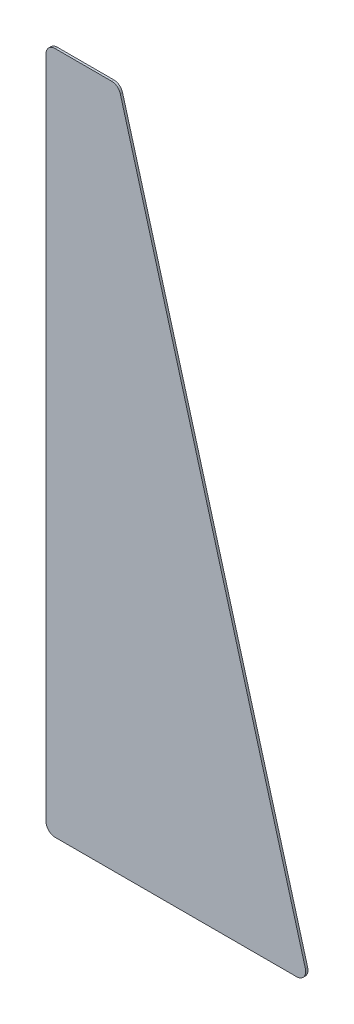
ISO-10303-21;
HEADER;
FILE_DESCRIPTION(('STEP AP214'),'2;1');
FILE_NAME('part.step','',(''),(''),'','','');
FILE_SCHEMA(('AUTOMOTIVE_DESIGN { 1 0 10303 214 1 1 1 1 }'));
ENDSEC;
DATA;
#1=APPLICATION_CONTEXT('core data for automotive mechanical design processes');
#2=APPLICATION_PROTOCOL_DEFINITION('international standard','automotive_design',2000,#1);
#3=PRODUCT_CONTEXT('',#1,'mechanical');
#4=PRODUCT('Part','Part','',(#3));
#5=PRODUCT_RELATED_PRODUCT_CATEGORY('part','',(#4));
#6=PRODUCT_DEFINITION_FORMATION('','',#4);
#7=PRODUCT_DEFINITION_CONTEXT('part definition',#1,'design');
#8=PRODUCT_DEFINITION('design','',#6,#7);
#9=PRODUCT_DEFINITION_SHAPE('','',#8);
#10=(LENGTH_UNIT() NAMED_UNIT(*) SI_UNIT(.MILLI.,.METRE.));
#11=(NAMED_UNIT(*) PLANE_ANGLE_UNIT() SI_UNIT($,.RADIAN.));
#12=(NAMED_UNIT(*) SI_UNIT($,.STERADIAN.) SOLID_ANGLE_UNIT());
#13=UNCERTAINTY_MEASURE_WITH_UNIT(LENGTH_MEASURE(1.E-05),#10,'distance_accuracy_value','');
#14=(GEOMETRIC_REPRESENTATION_CONTEXT(3) GLOBAL_UNCERTAINTY_ASSIGNED_CONTEXT((#13)) GLOBAL_UNIT_ASSIGNED_CONTEXT((#10,
#11,#12)) REPRESENTATION_CONTEXT('',''));
#15=CARTESIAN_POINT('',(0.,0.,0.));
#16=DIRECTION('',(0.,0.,1.));
#17=DIRECTION('',(1.,0.,0.));
#18=AXIS2_PLACEMENT_3D('',#15,#16,#17);
#19=CARTESIAN_POINT('',(184.15,0.,1.5875));
#20=DIRECTION('',(0.,1.,0.));
#21=DIRECTION('',(-1.,0.,0.));
#22=AXIS2_PLACEMENT_3D('',#19,#20,#21);
#23=PLANE('',#22);
#24=DIRECTION('',(1.,0.,0.));
#25=VECTOR('',#24,1.);
#26=CARTESIAN_POINT('',(184.15,0.,0.));
#27=LINE('',#26,#25);
#28=CARTESIAN_POINT('',(6.34999999999999,0.,0.));
#29=VERTEX_POINT('',#28);
#30=CARTESIAN_POINT('',(175.791529201927,0.,0.));
#31=VERTEX_POINT('',#30);
#32=EDGE_CURVE('E130',#29,#31,#27,.T.);
#33=ORIENTED_EDGE('',*,*,#32,.T.);
#34=DIRECTION('',(0.,0.,-1.));
#35=VECTOR('',#34,1.);
#36=CARTESIAN_POINT('',(175.791529201927,0.,1.5875));
#37=LINE('',#36,#35);
#38=CARTESIAN_POINT('',(175.791529201927,0.,1.5875));
#39=VERTEX_POINT('',#38);
#40=EDGE_CURVE('E108',#31,#39,#37,.F.);
#41=ORIENTED_EDGE('',*,*,#40,.T.);
#42=DIRECTION('',(1.,0.,0.));
#43=VECTOR('',#42,1.);
#44=CARTESIAN_POINT('',(184.15,0.,1.5875));
#45=LINE('',#44,#43);
#46=CARTESIAN_POINT('',(6.34999999999999,0.,1.5875));
#47=VERTEX_POINT('',#46);
#48=EDGE_CURVE('E139',#47,#39,#45,.T.);
#49=ORIENTED_EDGE('',*,*,#48,.F.);
#50=DIRECTION('',(0.,0.,-1.));
#51=VECTOR('',#50,1.);
#52=CARTESIAN_POINT('',(6.34999999999999,0.,1.5875));
#53=LINE('',#52,#51);
#54=EDGE_CURVE('E113',#47,#29,#53,.T.);
#55=ORIENTED_EDGE('',*,*,#54,.T.);
#56=EDGE_LOOP('',(#33,#41,#49,#55));
#57=FACE_BOUND('',#56,.T.);
#58=ADVANCED_FACE('F37',(#57),#23,.F.);
#59=CARTESIAN_POINT('',(50.8,479.171,1.5875));
#60=DIRECTION('',(-0.963389764635829,-0.268104758247448,0.));
#61=DIRECTION('',(0.268104758247448,-0.963389764635829,0.));
#62=AXIS2_PLACEMENT_3D('',#59,#60,#61);
#63=PLANE('',#62);
#64=DIRECTION('',(-0.268104758247448,0.963389764635829,0.));
#65=VECTOR('',#64,1.);
#66=CARTESIAN_POINT('',(50.8,479.171,1.5875));
#67=LINE('',#66,#65);
#68=CARTESIAN_POINT('',(181.909054207364,8.05246521487124,1.5875));
#69=VERTEX_POINT('',#68);
#70=CARTESIAN_POINT('',(52.0933770274013,474.523465214871,1.5875));
#71=VERTEX_POINT('',#70);
#72=EDGE_CURVE('E123',#69,#71,#67,.T.);
#73=ORIENTED_EDGE('',*,*,#72,.F.);
#74=DIRECTION('',(0.,0.,-1.));
#75=VECTOR('',#74,1.);
#76=CARTESIAN_POINT('',(181.909054207364,8.05246521487124,1.5875));
#77=LINE('',#76,#75);
#78=CARTESIAN_POINT('',(181.909054207364,8.05246521487124,0.));
#79=VERTEX_POINT('',#78);
#80=EDGE_CURVE('E107',#69,#79,#77,.T.);
#81=ORIENTED_EDGE('',*,*,#80,.T.);
#82=DIRECTION('',(-0.268104758247448,0.963389764635829,0.));
#83=VECTOR('',#82,1.);
#84=CARTESIAN_POINT('',(50.8,479.171,0.));
#85=LINE('',#84,#83);
#86=CARTESIAN_POINT('',(52.0933770274013,474.523465214871,0.));
#87=VERTEX_POINT('',#86);
#88=EDGE_CURVE('E120',#79,#87,#85,.T.);
#89=ORIENTED_EDGE('',*,*,#88,.T.);
#90=DIRECTION('',(0.,0.,-1.));
#91=VECTOR('',#90,1.);
#92=CARTESIAN_POINT('',(52.0933770274013,474.523465214871,1.5875));
#93=LINE('',#92,#91);
#94=EDGE_CURVE('E125',#87,#71,#93,.F.);
#95=ORIENTED_EDGE('',*,*,#94,.T.);
#96=EDGE_LOOP('',(#73,#81,#89,#95));
#97=FACE_BOUND('',#96,.T.);
#98=ADVANCED_FACE('F119',(#97),#63,.F.);
#99=CARTESIAN_POINT('',(0.,479.171,1.5875));
#100=DIRECTION('',(0.,-1.,0.));
#101=DIRECTION('',(0.,0.,-1.));
#102=AXIS2_PLACEMENT_3D('',#99,#100,#101);
#103=PLANE('',#102);
#104=DIRECTION('',(-1.,0.,0.));
#105=VECTOR('',#104,1.);
#106=CARTESIAN_POINT('',(0.,479.171,1.5875));
#107=LINE('',#106,#105);
#108=CARTESIAN_POINT('',(45.9758520219638,479.171,1.5875));
#109=VERTEX_POINT('',#108);
#110=CARTESIAN_POINT('',(6.35,479.171,1.5875));
#111=VERTEX_POINT('',#110);
#112=EDGE_CURVE('E165',#109,#111,#107,.T.);
#113=ORIENTED_EDGE('',*,*,#112,.F.);
#114=DIRECTION('',(0.,0.,-1.));
#115=VECTOR('',#114,1.);
#116=CARTESIAN_POINT('',(45.9758520219638,479.171,1.5875));
#117=LINE('',#116,#115);
#118=CARTESIAN_POINT('',(45.9758520219638,479.171,0.));
#119=VERTEX_POINT('',#118);
#120=EDGE_CURVE('E158',#109,#119,#117,.T.);
#121=ORIENTED_EDGE('',*,*,#120,.T.);
#122=DIRECTION('',(-1.,0.,0.));
#123=VECTOR('',#122,1.);
#124=CARTESIAN_POINT('',(0.,479.171,0.));
#125=LINE('',#124,#123);
#126=CARTESIAN_POINT('',(6.35,479.171,0.));
#127=VERTEX_POINT('',#126);
#128=EDGE_CURVE('E129',#119,#127,#125,.T.);
#129=ORIENTED_EDGE('',*,*,#128,.T.);
#130=DIRECTION('',(0.,0.,-1.));
#131=VECTOR('',#130,1.);
#132=CARTESIAN_POINT('',(6.35,479.171,1.5875));
#133=LINE('',#132,#131);
#134=EDGE_CURVE('E156',#127,#111,#133,.F.);
#135=ORIENTED_EDGE('',*,*,#134,.T.);
#136=EDGE_LOOP('',(#113,#121,#129,#135));
#137=FACE_BOUND('',#136,.T.);
#138=ADVANCED_FACE('F163',(#137),#103,.F.);
#139=CARTESIAN_POINT('',(0.,0.,1.5875));
#140=DIRECTION('',(1.,0.,0.));
#141=DIRECTION('',(0.,0.,-1.));
#142=AXIS2_PLACEMENT_3D('',#139,#140,#141);
#143=PLANE('',#142);
#144=DIRECTION('',(0.,-1.,0.));
#145=VECTOR('',#144,1.);
#146=CARTESIAN_POINT('',(0.,0.,1.5875));
#147=LINE('',#146,#145);
#148=CARTESIAN_POINT('',(0.,472.821,1.5875));
#149=VERTEX_POINT('',#148);
#150=CARTESIAN_POINT('',(0.,6.35,1.5875));
#151=VERTEX_POINT('',#150);
#152=EDGE_CURVE('E140',#149,#151,#147,.T.);
#153=ORIENTED_EDGE('',*,*,#152,.F.);
#154=DIRECTION('',(0.,0.,-1.));
#155=VECTOR('',#154,1.);
#156=CARTESIAN_POINT('',(0.,472.821,1.5875));
#157=LINE('',#156,#155);
#158=CARTESIAN_POINT('',(0.,472.821,0.));
#159=VERTEX_POINT('',#158);
#160=EDGE_CURVE('E11',#149,#159,#157,.T.);
#161=ORIENTED_EDGE('',*,*,#160,.T.);
#162=DIRECTION('',(0.,-1.,0.));
#163=VECTOR('',#162,1.);
#164=CARTESIAN_POINT('',(0.,0.,0.));
#165=LINE('',#164,#163);
#166=CARTESIAN_POINT('',(0.,6.35,0.));
#167=VERTEX_POINT('',#166);
#168=EDGE_CURVE('E133',#159,#167,#165,.T.);
#169=ORIENTED_EDGE('',*,*,#168,.T.);
#170=DIRECTION('',(0.,0.,-1.));
#171=VECTOR('',#170,1.);
#172=CARTESIAN_POINT('',(0.,6.35,1.5875));
#173=LINE('',#172,#171);
#174=EDGE_CURVE('E45',#167,#151,#173,.F.);
#175=ORIENTED_EDGE('',*,*,#174,.T.);
#176=EDGE_LOOP('',(#153,#161,#169,#175));
#177=FACE_BOUND('',#176,.T.);
#178=ADVANCED_FACE('F172',(#177),#143,.F.);
#179=CARTESIAN_POINT('',(0.,0.,1.5875));
#180=DIRECTION('',(0.,0.,-1.));
#181=DIRECTION('',(-1.,0.,0.));
#182=AXIS2_PLACEMENT_3D('',#179,#180,#181);
#183=PLANE('',#182);
#184=ORIENTED_EDGE('',*,*,#48,.T.);
#185=CARTESIAN_POINT('',(175.791529201927,6.35000000000002,1.5875));
#186=DIRECTION('',(0.,0.,-1.));
#187=DIRECTION('',(-1.,0.,0.));
#188=AXIS2_PLACEMENT_3D('',#185,#186,#187);
#189=CIRCLE('',#188,6.35);
#190=EDGE_CURVE('E154',#39,#69,#189,.F.);
#191=ORIENTED_EDGE('',*,*,#190,.T.);
#192=ORIENTED_EDGE('',*,*,#72,.T.);
#193=CARTESIAN_POINT('',(45.9758520219638,472.821,1.5875));
#194=DIRECTION('',(0.,0.,-1.));
#195=DIRECTION('',(-1.,0.,0.));
#196=AXIS2_PLACEMENT_3D('',#193,#194,#195);
#197=CIRCLE('',#196,6.35);
#198=EDGE_CURVE('E152',#71,#109,#197,.F.);
#199=ORIENTED_EDGE('',*,*,#198,.T.);
#200=ORIENTED_EDGE('',*,*,#112,.T.);
#201=CARTESIAN_POINT('',(6.35,472.821,1.5875));
#202=DIRECTION('',(0.,0.,-1.));
#203=DIRECTION('',(-1.,0.,0.));
#204=AXIS2_PLACEMENT_3D('',#201,#202,#203);
#205=CIRCLE('',#204,6.35);
#206=EDGE_CURVE('E58',#111,#149,#205,.F.);
#207=ORIENTED_EDGE('',*,*,#206,.T.);
#208=ORIENTED_EDGE('',*,*,#152,.T.);
#209=CARTESIAN_POINT('',(6.34999999999999,6.35,1.5875));
#210=DIRECTION('',(0.,0.,-1.));
#211=DIRECTION('',(-1.,0.,0.));
#212=AXIS2_PLACEMENT_3D('',#209,#210,#211);
#213=CIRCLE('',#212,6.35);
#214=EDGE_CURVE('E149',#151,#47,#213,.F.);
#215=ORIENTED_EDGE('',*,*,#214,.T.);
#216=EDGE_LOOP('',(#184,#191,#192,#199,#200,#207,#208,#215));
#217=FACE_BOUND('',#216,.T.);
#218=ADVANCED_FACE('F179',(#217),#183,.F.);
#219=CARTESIAN_POINT('',(0.,0.,0.));
#220=DIRECTION('',(0.,0.,-1.));
#221=DIRECTION('',(-1.,0.,0.));
#222=AXIS2_PLACEMENT_3D('',#219,#220,#221);
#223=PLANE('',#222);
#224=ORIENTED_EDGE('',*,*,#88,.F.);
#225=CARTESIAN_POINT('',(175.791529201927,6.35000000000002,0.));
#226=DIRECTION('',(0.,0.,-1.));
#227=DIRECTION('',(-1.,0.,0.));
#228=AXIS2_PLACEMENT_3D('',#225,#226,#227);
#229=CIRCLE('',#228,6.35);
#230=EDGE_CURVE('E103',#79,#31,#229,.T.);
#231=ORIENTED_EDGE('',*,*,#230,.T.);
#232=ORIENTED_EDGE('',*,*,#32,.F.);
#233=CARTESIAN_POINT('',(6.34999999999999,6.35,0.));
#234=DIRECTION('',(0.,0.,-1.));
#235=DIRECTION('',(-1.,0.,0.));
#236=AXIS2_PLACEMENT_3D('',#233,#234,#235);
#237=CIRCLE('',#236,6.35);
#238=EDGE_CURVE('E124',#29,#167,#237,.T.);
#239=ORIENTED_EDGE('',*,*,#238,.T.);
#240=ORIENTED_EDGE('',*,*,#168,.F.);
#241=CARTESIAN_POINT('',(6.35,472.821,0.));
#242=DIRECTION('',(0.,0.,-1.));
#243=DIRECTION('',(-1.,0.,0.));
#244=AXIS2_PLACEMENT_3D('',#241,#242,#243);
#245=CIRCLE('',#244,6.35);
#246=EDGE_CURVE('E143',#159,#127,#245,.T.);
#247=ORIENTED_EDGE('',*,*,#246,.T.);
#248=ORIENTED_EDGE('',*,*,#128,.F.);
#249=CARTESIAN_POINT('',(45.9758520219638,472.821,0.));
#250=DIRECTION('',(0.,0.,-1.));
#251=DIRECTION('',(-1.,0.,0.));
#252=AXIS2_PLACEMENT_3D('',#249,#250,#251);
#253=CIRCLE('',#252,6.35);
#254=EDGE_CURVE('E114',#119,#87,#253,.T.);
#255=ORIENTED_EDGE('',*,*,#254,.T.);
#256=EDGE_LOOP('',(#224,#231,#232,#239,#240,#247,#248,#255));
#257=FACE_BOUND('',#256,.T.);
#258=ADVANCED_FACE('F127',(#257),#223,.T.);
#259=CARTESIAN_POINT('',(175.791529201927,6.35000000000002,1.5875));
#260=DIRECTION('',(0.,0.,-1.));
#261=DIRECTION('',(-1.,0.,0.));
#262=AXIS2_PLACEMENT_3D('',#259,#260,#261);
#263=CYLINDRICAL_SURFACE('',#262,6.35);
#264=ORIENTED_EDGE('',*,*,#190,.F.);
#265=ORIENTED_EDGE('',*,*,#40,.F.);
#266=ORIENTED_EDGE('',*,*,#230,.F.);
#267=ORIENTED_EDGE('',*,*,#80,.F.);
#268=EDGE_LOOP('',(#264,#265,#266,#267));
#269=FACE_BOUND('',#268,.T.);
#270=ADVANCED_FACE('F106',(#269),#263,.T.);
#271=CARTESIAN_POINT('',(45.9758520219638,472.821,1.5875));
#272=DIRECTION('',(0.,0.,-1.));
#273=DIRECTION('',(-1.,0.,0.));
#274=AXIS2_PLACEMENT_3D('',#271,#272,#273);
#275=CYLINDRICAL_SURFACE('',#274,6.35);
#276=ORIENTED_EDGE('',*,*,#198,.F.);
#277=ORIENTED_EDGE('',*,*,#94,.F.);
#278=ORIENTED_EDGE('',*,*,#254,.F.);
#279=ORIENTED_EDGE('',*,*,#120,.F.);
#280=EDGE_LOOP('',(#276,#277,#278,#279));
#281=FACE_BOUND('',#280,.T.);
#282=ADVANCED_FACE('F187',(#281),#275,.T.);
#283=CARTESIAN_POINT('',(6.35,472.821,1.5875));
#284=DIRECTION('',(0.,0.,-1.));
#285=DIRECTION('',(-1.,0.,0.));
#286=AXIS2_PLACEMENT_3D('',#283,#284,#285);
#287=CYLINDRICAL_SURFACE('',#286,6.35);
#288=ORIENTED_EDGE('',*,*,#206,.F.);
#289=ORIENTED_EDGE('',*,*,#134,.F.);
#290=ORIENTED_EDGE('',*,*,#246,.F.);
#291=ORIENTED_EDGE('',*,*,#160,.F.);
#292=EDGE_LOOP('',(#288,#289,#290,#291));
#293=FACE_BOUND('',#292,.T.);
#294=ADVANCED_FACE('F171',(#293),#287,.T.);
#295=CARTESIAN_POINT('',(6.34999999999999,6.35,1.5875));
#296=DIRECTION('',(0.,0.,-1.));
#297=DIRECTION('',(-1.,0.,0.));
#298=AXIS2_PLACEMENT_3D('',#295,#296,#297);
#299=CYLINDRICAL_SURFACE('',#298,6.35);
#300=ORIENTED_EDGE('',*,*,#214,.F.);
#301=ORIENTED_EDGE('',*,*,#174,.F.);
#302=ORIENTED_EDGE('',*,*,#238,.F.);
#303=ORIENTED_EDGE('',*,*,#54,.F.);
#304=EDGE_LOOP('',(#300,#301,#302,#303));
#305=FACE_BOUND('',#304,.T.);
#306=ADVANCED_FACE('F39',(#305),#299,.T.);
#307=CLOSED_SHELL('',(#58,#98,#138,#178,#218,#258,#270,#282,#294,#306));
#308=MANIFOLD_SOLID_BREP('B2',#307);
#309=ADVANCED_BREP_SHAPE_REPRESENTATION('',(#18,#308),#14);
#310=SHAPE_DEFINITION_REPRESENTATION(#9,#309);
ENDSEC;
END-ISO-10303-21;
